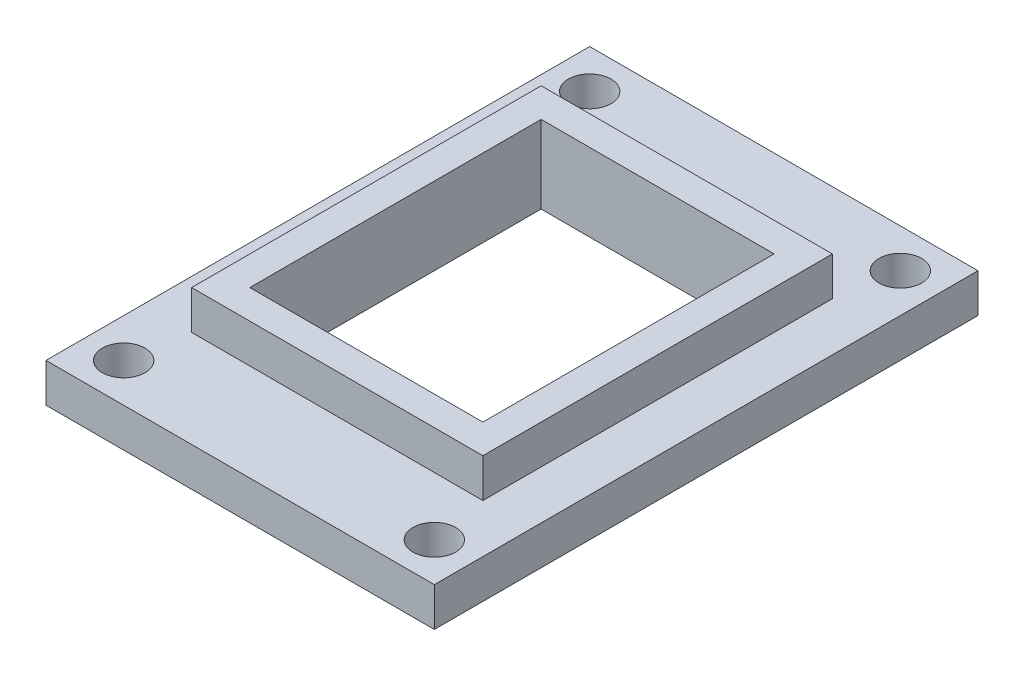
ISO-10303-21;
HEADER;
FILE_DESCRIPTION(('STEP AP214'),'2;1');
FILE_NAME('part.step','',(''),(''),'','','');
FILE_SCHEMA(('AUTOMOTIVE_DESIGN { 1 0 10303 214 1 1 1 1 }'));
ENDSEC;
DATA;
#1=APPLICATION_CONTEXT('core data for automotive mechanical design processes');
#2=APPLICATION_PROTOCOL_DEFINITION('international standard','automotive_design',2000,#1);
#3=PRODUCT_CONTEXT('',#1,'mechanical');
#4=PRODUCT('Part','Part','',(#3));
#5=PRODUCT_RELATED_PRODUCT_CATEGORY('part','',(#4));
#6=PRODUCT_DEFINITION_FORMATION('','',#4);
#7=PRODUCT_DEFINITION_CONTEXT('part definition',#1,'design');
#8=PRODUCT_DEFINITION('design','',#6,#7);
#9=PRODUCT_DEFINITION_SHAPE('','',#8);
#10=(LENGTH_UNIT() NAMED_UNIT(*) SI_UNIT(.MILLI.,.METRE.));
#11=(NAMED_UNIT(*) PLANE_ANGLE_UNIT() SI_UNIT($,.RADIAN.));
#12=(NAMED_UNIT(*) SI_UNIT($,.STERADIAN.) SOLID_ANGLE_UNIT());
#13=UNCERTAINTY_MEASURE_WITH_UNIT(LENGTH_MEASURE(1.E-05),#10,'distance_accuracy_value','');
#14=(GEOMETRIC_REPRESENTATION_CONTEXT(3) GLOBAL_UNCERTAINTY_ASSIGNED_CONTEXT((#13)) GLOBAL_UNIT_ASSIGNED_CONTEXT((#10,
#11,#12)) REPRESENTATION_CONTEXT('',''));
#15=CARTESIAN_POINT('',(0.,0.,0.));
#16=DIRECTION('',(0.,0.,1.));
#17=DIRECTION('',(1.,0.,0.));
#18=AXIS2_PLACEMENT_3D('',#15,#16,#17);
#19=CARTESIAN_POINT('',(0.,5.08,0.));
#20=DIRECTION('',(0.,-1.,0.));
#21=DIRECTION('',(0.,0.,-1.));
#22=AXIS2_PLACEMENT_3D('',#19,#20,#21);
#23=PLANE('',#22);
#24=DIRECTION('',(1.,0.,0.));
#25=VECTOR('',#24,1.);
#26=CARTESIAN_POINT('',(9.525,5.08,11.43));
#27=LINE('',#26,#25);
#28=CARTESIAN_POINT('',(-9.525,5.08,11.43));
#29=VERTEX_POINT('',#28);
#30=CARTESIAN_POINT('',(9.525,5.08,11.43));
#31=VERTEX_POINT('',#30);
#32=EDGE_CURVE('E157',#29,#31,#27,.T.);
#33=ORIENTED_EDGE('',*,*,#32,.T.);
#34=DIRECTION('',(0.,0.,-1.));
#35=VECTOR('',#34,1.);
#36=CARTESIAN_POINT('',(9.525,5.08,11.43));
#37=LINE('',#36,#35);
#38=CARTESIAN_POINT('',(9.525,5.08,-11.43));
#39=VERTEX_POINT('',#38);
#40=EDGE_CURVE('E153',#31,#39,#37,.T.);
#41=ORIENTED_EDGE('',*,*,#40,.T.);
#42=DIRECTION('',(-1.,0.,0.));
#43=VECTOR('',#42,1.);
#44=CARTESIAN_POINT('',(9.525,5.08,-11.43));
#45=LINE('',#44,#43);
#46=CARTESIAN_POINT('',(-9.525,5.08,-11.43));
#47=VERTEX_POINT('',#46);
#48=EDGE_CURVE('E158',#39,#47,#45,.T.);
#49=ORIENTED_EDGE('',*,*,#48,.T.);
#50=DIRECTION('',(0.,0.,1.));
#51=VECTOR('',#50,1.);
#52=CARTESIAN_POINT('',(-9.525,5.08,11.43));
#53=LINE('',#52,#51);
#54=EDGE_CURVE('E162',#47,#29,#53,.T.);
#55=ORIENTED_EDGE('',*,*,#54,.T.);
#56=EDGE_LOOP('',(#33,#41,#49,#55));
#57=FACE_BOUND('',#56,.T.);
#58=DIRECTION('',(0.,0.,1.));
#59=VECTOR('',#58,1.);
#60=CARTESIAN_POINT('',(-7.62,5.08,9.525));
#61=LINE('',#60,#59);
#62=CARTESIAN_POINT('',(-7.62,5.08,-9.525));
#63=VERTEX_POINT('',#62);
#64=CARTESIAN_POINT('',(-7.62,5.08,9.525));
#65=VERTEX_POINT('',#64);
#66=EDGE_CURVE('E245',#63,#65,#61,.T.);
#67=ORIENTED_EDGE('',*,*,#66,.F.);
#68=DIRECTION('',(-1.,0.,0.));
#69=VECTOR('',#68,1.);
#70=CARTESIAN_POINT('',(7.62,5.08,-9.525));
#71=LINE('',#70,#69);
#72=CARTESIAN_POINT('',(7.62,5.08,-9.525));
#73=VERTEX_POINT('',#72);
#74=EDGE_CURVE('E252',#73,#63,#71,.T.);
#75=ORIENTED_EDGE('',*,*,#74,.F.);
#76=DIRECTION('',(0.,0.,-1.));
#77=VECTOR('',#76,1.);
#78=CARTESIAN_POINT('',(7.62,5.08,9.525));
#79=LINE('',#78,#77);
#80=CARTESIAN_POINT('',(7.62,5.08,9.525));
#81=VERTEX_POINT('',#80);
#82=EDGE_CURVE('E250',#81,#73,#79,.T.);
#83=ORIENTED_EDGE('',*,*,#82,.F.);
#84=DIRECTION('',(1.,0.,0.));
#85=VECTOR('',#84,1.);
#86=CARTESIAN_POINT('',(7.62,5.08,9.525));
#87=LINE('',#86,#85);
#88=EDGE_CURVE('E243',#65,#81,#87,.T.);
#89=ORIENTED_EDGE('',*,*,#88,.F.);
#90=EDGE_LOOP('',(#67,#75,#83,#89));
#91=FACE_BOUND('',#90,.T.);
#92=ADVANCED_FACE('F44',(#57,#91),#23,.F.);
#93=CARTESIAN_POINT('',(0.,0.,0.));
#94=DIRECTION('',(0.,-1.,0.));
#95=DIRECTION('',(0.,0.,-1.));
#96=AXIS2_PLACEMENT_3D('',#93,#94,#95);
#97=PLANE('',#96);
#98=DIRECTION('',(-1.,0.,0.));
#99=VECTOR('',#98,1.);
#100=CARTESIAN_POINT('',(7.62,0.,-9.525));
#101=LINE('',#100,#99);
#102=CARTESIAN_POINT('',(7.62,0.,-9.525));
#103=VERTEX_POINT('',#102);
#104=CARTESIAN_POINT('',(-7.62,0.,-9.525));
#105=VERTEX_POINT('',#104);
#106=EDGE_CURVE('E248',#103,#105,#101,.T.);
#107=ORIENTED_EDGE('',*,*,#106,.T.);
#108=DIRECTION('',(0.,0.,1.));
#109=VECTOR('',#108,1.);
#110=CARTESIAN_POINT('',(-7.62,0.,9.525));
#111=LINE('',#110,#109);
#112=CARTESIAN_POINT('',(-7.62,0.,9.525));
#113=VERTEX_POINT('',#112);
#114=EDGE_CURVE('E242',#105,#113,#111,.T.);
#115=ORIENTED_EDGE('',*,*,#114,.T.);
#116=DIRECTION('',(1.,0.,0.));
#117=VECTOR('',#116,1.);
#118=CARTESIAN_POINT('',(7.62,0.,9.525));
#119=LINE('',#118,#117);
#120=CARTESIAN_POINT('',(7.62,0.,9.525));
#121=VERTEX_POINT('',#120);
#122=EDGE_CURVE('E259',#113,#121,#119,.T.);
#123=ORIENTED_EDGE('',*,*,#122,.T.);
#124=DIRECTION('',(0.,0.,-1.));
#125=VECTOR('',#124,1.);
#126=CARTESIAN_POINT('',(7.62,0.,9.525));
#127=LINE('',#126,#125);
#128=EDGE_CURVE('E263',#121,#103,#127,.T.);
#129=ORIENTED_EDGE('',*,*,#128,.T.);
#130=EDGE_LOOP('',(#107,#115,#123,#129));
#131=FACE_BOUND('',#130,.T.);
#132=DIRECTION('',(0.,0.,1.));
#133=VECTOR('',#132,1.);
#134=CARTESIAN_POINT('',(-12.7,0.,-17.78));
#135=LINE('',#134,#133);
#136=CARTESIAN_POINT('',(-12.7,0.,-17.78));
#137=VERTEX_POINT('',#136);
#138=CARTESIAN_POINT('',(-12.7,0.,17.78));
#139=VERTEX_POINT('',#138);
#140=EDGE_CURVE('E200',#137,#139,#135,.T.);
#141=ORIENTED_EDGE('',*,*,#140,.F.);
#142=DIRECTION('',(-1.,0.,0.));
#143=VECTOR('',#142,1.);
#144=CARTESIAN_POINT('',(-12.7,0.,-17.78));
#145=LINE('',#144,#143);
#146=CARTESIAN_POINT('',(12.7,0.,-17.78));
#147=VERTEX_POINT('',#146);
#148=EDGE_CURVE('E202',#147,#137,#145,.T.);
#149=ORIENTED_EDGE('',*,*,#148,.F.);
#150=DIRECTION('',(0.,0.,-1.));
#151=VECTOR('',#150,1.);
#152=CARTESIAN_POINT('',(12.7,0.,-17.78));
#153=LINE('',#152,#151);
#154=CARTESIAN_POINT('',(12.7,0.,17.78));
#155=VERTEX_POINT('',#154);
#156=EDGE_CURVE('E222',#155,#147,#153,.T.);
#157=ORIENTED_EDGE('',*,*,#156,.F.);
#158=DIRECTION('',(1.,0.,0.));
#159=VECTOR('',#158,1.);
#160=CARTESIAN_POINT('',(-12.7,0.,17.78));
#161=LINE('',#160,#159);
#162=EDGE_CURVE('E217',#139,#155,#161,.T.);
#163=ORIENTED_EDGE('',*,*,#162,.F.);
#164=EDGE_LOOP('',(#141,#149,#157,#163));
#165=FACE_BOUND('',#164,.T.);
#166=CARTESIAN_POINT('',(-10.16,0.,-15.24));
#167=DIRECTION('',(0.,1.,0.));
#168=DIRECTION('',(0.,0.,1.));
#169=AXIS2_PLACEMENT_3D('',#166,#167,#168);
#170=CIRCLE('',#169,1.397);
#171=CARTESIAN_POINT('',(-10.16,0.,-13.843));
#172=VERTEX_POINT('',#171);
#173=EDGE_CURVE('E192',#172,#172,#170,.T.);
#174=ORIENTED_EDGE('',*,*,#173,.T.);
#175=EDGE_LOOP('',(#174));
#176=FACE_BOUND('',#175,.T.);
#177=CARTESIAN_POINT('',(10.16,0.,-15.24));
#178=DIRECTION('',(0.,1.,0.));
#179=DIRECTION('',(0.,0.,-1.));
#180=AXIS2_PLACEMENT_3D('',#177,#178,#179);
#181=CIRCLE('',#180,1.397);
#182=CARTESIAN_POINT('',(10.16,0.,-16.637));
#183=VERTEX_POINT('',#182);
#184=EDGE_CURVE('E481',#183,#183,#181,.T.);
#185=ORIENTED_EDGE('',*,*,#184,.T.);
#186=EDGE_LOOP('',(#185));
#187=FACE_BOUND('',#186,.T.);
#188=CARTESIAN_POINT('',(-10.16,0.,15.24));
#189=DIRECTION('',(0.,1.,0.));
#190=DIRECTION('',(0.,0.,-1.));
#191=AXIS2_PLACEMENT_3D('',#188,#189,#190);
#192=CIRCLE('',#191,1.397);
#193=CARTESIAN_POINT('',(-10.16,0.,13.843));
#194=VERTEX_POINT('',#193);
#195=EDGE_CURVE('E475',#194,#194,#192,.T.);
#196=ORIENTED_EDGE('',*,*,#195,.T.);
#197=EDGE_LOOP('',(#196));
#198=FACE_BOUND('',#197,.T.);
#199=CARTESIAN_POINT('',(10.16,0.,15.24));
#200=DIRECTION('',(0.,1.,0.));
#201=DIRECTION('',(0.,0.,1.));
#202=AXIS2_PLACEMENT_3D('',#199,#200,#201);
#203=CIRCLE('',#202,1.397);
#204=CARTESIAN_POINT('',(10.16,0.,16.637));
#205=VERTEX_POINT('',#204);
#206=EDGE_CURVE('E470',#205,#205,#203,.T.);
#207=ORIENTED_EDGE('',*,*,#206,.T.);
#208=EDGE_LOOP('',(#207));
#209=FACE_BOUND('',#208,.T.);
#210=ADVANCED_FACE('F283',(#131,#165,#176,#187,#198,#209),#97,.T.);
#211=CARTESIAN_POINT('',(9.525,5.08,11.43));
#212=DIRECTION('',(0.,0.,-1.));
#213=DIRECTION('',(-1.,0.,0.));
#214=AXIS2_PLACEMENT_3D('',#211,#212,#213);
#215=PLANE('',#214);
#216=DIRECTION('',(0.,-1.,0.));
#217=VECTOR('',#216,1.);
#218=CARTESIAN_POINT('',(-9.525,5.08,11.43));
#219=LINE('',#218,#217);
#220=CARTESIAN_POINT('',(-9.525,2.54,11.43));
#221=VERTEX_POINT('',#220);
#222=EDGE_CURVE('E146',#29,#221,#219,.T.);
#223=ORIENTED_EDGE('',*,*,#222,.T.);
#224=DIRECTION('',(1.,0.,0.));
#225=VECTOR('',#224,1.);
#226=CARTESIAN_POINT('',(-9.525,2.54,11.43));
#227=LINE('',#226,#225);
#228=CARTESIAN_POINT('',(9.525,2.54,11.43));
#229=VERTEX_POINT('',#228);
#230=EDGE_CURVE('E62',#221,#229,#227,.T.);
#231=ORIENTED_EDGE('',*,*,#230,.T.);
#232=DIRECTION('',(0.,-1.,0.));
#233=VECTOR('',#232,1.);
#234=CARTESIAN_POINT('',(9.525,5.08,11.43));
#235=LINE('',#234,#233);
#236=EDGE_CURVE('E11',#31,#229,#235,.T.);
#237=ORIENTED_EDGE('',*,*,#236,.F.);
#238=ORIENTED_EDGE('',*,*,#32,.F.);
#239=EDGE_LOOP('',(#223,#231,#237,#238));
#240=FACE_BOUND('',#239,.T.);
#241=ADVANCED_FACE('F50',(#240),#215,.F.);
#242=CARTESIAN_POINT('',(9.525,5.08,11.43));
#243=DIRECTION('',(-1.,0.,0.));
#244=DIRECTION('',(0.,0.,1.));
#245=AXIS2_PLACEMENT_3D('',#242,#243,#244);
#246=PLANE('',#245);
#247=ORIENTED_EDGE('',*,*,#236,.T.);
#248=DIRECTION('',(0.,0.,-1.));
#249=VECTOR('',#248,1.);
#250=CARTESIAN_POINT('',(9.525,2.54,11.43));
#251=LINE('',#250,#249);
#252=CARTESIAN_POINT('',(9.525,2.54,-11.43));
#253=VERTEX_POINT('',#252);
#254=EDGE_CURVE('E134',#229,#253,#251,.T.);
#255=ORIENTED_EDGE('',*,*,#254,.T.);
#256=DIRECTION('',(0.,-1.,0.));
#257=VECTOR('',#256,1.);
#258=CARTESIAN_POINT('',(9.525,5.08,-11.43));
#259=LINE('',#258,#257);
#260=EDGE_CURVE('E53',#39,#253,#259,.T.);
#261=ORIENTED_EDGE('',*,*,#260,.F.);
#262=ORIENTED_EDGE('',*,*,#40,.F.);
#263=EDGE_LOOP('',(#247,#255,#261,#262));
#264=FACE_BOUND('',#263,.T.);
#265=ADVANCED_FACE('F155',(#264),#246,.F.);
#266=CARTESIAN_POINT('',(9.525,5.08,-11.43));
#267=DIRECTION('',(0.,0.,1.));
#268=DIRECTION('',(1.,0.,0.));
#269=AXIS2_PLACEMENT_3D('',#266,#267,#268);
#270=PLANE('',#269);
#271=ORIENTED_EDGE('',*,*,#260,.T.);
#272=DIRECTION('',(-1.,0.,0.));
#273=VECTOR('',#272,1.);
#274=CARTESIAN_POINT('',(9.525,2.54,-11.43));
#275=LINE('',#274,#273);
#276=CARTESIAN_POINT('',(-9.525,2.54,-11.43));
#277=VERTEX_POINT('',#276);
#278=EDGE_CURVE('E139',#253,#277,#275,.T.);
#279=ORIENTED_EDGE('',*,*,#278,.T.);
#280=DIRECTION('',(0.,-1.,0.));
#281=VECTOR('',#280,1.);
#282=CARTESIAN_POINT('',(-9.525,5.08,-11.43));
#283=LINE('',#282,#281);
#284=EDGE_CURVE('E180',#47,#277,#283,.T.);
#285=ORIENTED_EDGE('',*,*,#284,.F.);
#286=ORIENTED_EDGE('',*,*,#48,.F.);
#287=EDGE_LOOP('',(#271,#279,#285,#286));
#288=FACE_BOUND('',#287,.T.);
#289=ADVANCED_FACE('F184',(#288),#270,.F.);
#290=CARTESIAN_POINT('',(-9.525,5.08,11.43));
#291=DIRECTION('',(1.,0.,0.));
#292=DIRECTION('',(0.,0.,-1.));
#293=AXIS2_PLACEMENT_3D('',#290,#291,#292);
#294=PLANE('',#293);
#295=ORIENTED_EDGE('',*,*,#284,.T.);
#296=DIRECTION('',(0.,0.,1.));
#297=VECTOR('',#296,1.);
#298=CARTESIAN_POINT('',(-9.525,2.54,-11.43));
#299=LINE('',#298,#297);
#300=EDGE_CURVE('E147',#277,#221,#299,.T.);
#301=ORIENTED_EDGE('',*,*,#300,.T.);
#302=ORIENTED_EDGE('',*,*,#222,.F.);
#303=ORIENTED_EDGE('',*,*,#54,.F.);
#304=EDGE_LOOP('',(#295,#301,#302,#303));
#305=FACE_BOUND('',#304,.T.);
#306=ADVANCED_FACE('F190',(#305),#294,.F.);
#307=CARTESIAN_POINT('',(-7.62,5.08,9.525));
#308=DIRECTION('',(1.,0.,0.));
#309=DIRECTION('',(0.,0.,-1.));
#310=AXIS2_PLACEMENT_3D('',#307,#308,#309);
#311=PLANE('',#310);
#312=ORIENTED_EDGE('',*,*,#114,.F.);
#313=DIRECTION('',(0.,-1.,0.));
#314=VECTOR('',#313,1.);
#315=CARTESIAN_POINT('',(-7.62,5.08,-9.525));
#316=LINE('',#315,#314);
#317=EDGE_CURVE('E254',#63,#105,#316,.T.);
#318=ORIENTED_EDGE('',*,*,#317,.F.);
#319=ORIENTED_EDGE('',*,*,#66,.T.);
#320=DIRECTION('',(0.,-1.,0.));
#321=VECTOR('',#320,1.);
#322=CARTESIAN_POINT('',(-7.62,5.08,9.525));
#323=LINE('',#322,#321);
#324=EDGE_CURVE('E164',#65,#113,#323,.T.);
#325=ORIENTED_EDGE('',*,*,#324,.T.);
#326=EDGE_LOOP('',(#312,#318,#319,#325));
#327=FACE_BOUND('',#326,.T.);
#328=ADVANCED_FACE('F290',(#327),#311,.T.);
#329=CARTESIAN_POINT('',(7.62,5.08,9.525));
#330=DIRECTION('',(0.,0.,-1.));
#331=DIRECTION('',(-1.,0.,0.));
#332=AXIS2_PLACEMENT_3D('',#329,#330,#331);
#333=PLANE('',#332);
#334=ORIENTED_EDGE('',*,*,#122,.F.);
#335=ORIENTED_EDGE('',*,*,#324,.F.);
#336=ORIENTED_EDGE('',*,*,#88,.T.);
#337=DIRECTION('',(0.,-1.,0.));
#338=VECTOR('',#337,1.);
#339=CARTESIAN_POINT('',(7.62,5.08,9.525));
#340=LINE('',#339,#338);
#341=EDGE_CURVE('E166',#81,#121,#340,.T.);
#342=ORIENTED_EDGE('',*,*,#341,.T.);
#343=EDGE_LOOP('',(#334,#335,#336,#342));
#344=FACE_BOUND('',#343,.T.);
#345=ADVANCED_FACE('F279',(#344),#333,.T.);
#346=CARTESIAN_POINT('',(7.62,5.08,9.525));
#347=DIRECTION('',(-1.,0.,0.));
#348=DIRECTION('',(0.,0.,1.));
#349=AXIS2_PLACEMENT_3D('',#346,#347,#348);
#350=PLANE('',#349);
#351=ORIENTED_EDGE('',*,*,#128,.F.);
#352=ORIENTED_EDGE('',*,*,#341,.F.);
#353=ORIENTED_EDGE('',*,*,#82,.T.);
#354=DIRECTION('',(0.,-1.,0.));
#355=VECTOR('',#354,1.);
#356=CARTESIAN_POINT('',(7.62,5.08,-9.525));
#357=LINE('',#356,#355);
#358=EDGE_CURVE('E70',#73,#103,#357,.T.);
#359=ORIENTED_EDGE('',*,*,#358,.T.);
#360=EDGE_LOOP('',(#351,#352,#353,#359));
#361=FACE_BOUND('',#360,.T.);
#362=ADVANCED_FACE('F284',(#361),#350,.T.);
#363=CARTESIAN_POINT('',(7.62,5.08,-9.525));
#364=DIRECTION('',(0.,0.,1.));
#365=DIRECTION('',(1.,0.,0.));
#366=AXIS2_PLACEMENT_3D('',#363,#364,#365);
#367=PLANE('',#366);
#368=ORIENTED_EDGE('',*,*,#106,.F.);
#369=ORIENTED_EDGE('',*,*,#358,.F.);
#370=ORIENTED_EDGE('',*,*,#74,.T.);
#371=ORIENTED_EDGE('',*,*,#317,.T.);
#372=EDGE_LOOP('',(#368,#369,#370,#371));
#373=FACE_BOUND('',#372,.T.);
#374=ADVANCED_FACE('F292',(#373),#367,.T.);
#375=CARTESIAN_POINT('',(0.,2.54,0.));
#376=DIRECTION('',(0.,1.,0.));
#377=DIRECTION('',(0.,0.,1.));
#378=AXIS2_PLACEMENT_3D('',#375,#376,#377);
#379=PLANE('',#378);
#380=CARTESIAN_POINT('',(-10.16,2.54,15.24));
#381=DIRECTION('',(0.,1.,0.));
#382=DIRECTION('',(0.,0.,-1.));
#383=AXIS2_PLACEMENT_3D('',#380,#381,#382);
#384=CIRCLE('',#383,1.397);
#385=CARTESIAN_POINT('',(-10.16,2.54,13.843));
#386=VERTEX_POINT('',#385);
#387=EDGE_CURVE('E480',#386,#386,#384,.T.);
#388=ORIENTED_EDGE('',*,*,#387,.F.);
#389=EDGE_LOOP('',(#388));
#390=FACE_BOUND('',#389,.T.);
#391=CARTESIAN_POINT('',(-10.16,2.54,-15.24));
#392=DIRECTION('',(0.,1.,0.));
#393=DIRECTION('',(0.,0.,1.));
#394=AXIS2_PLACEMENT_3D('',#391,#392,#393);
#395=CIRCLE('',#394,1.397);
#396=CARTESIAN_POINT('',(-10.16,2.54,-13.843));
#397=VERTEX_POINT('',#396);
#398=EDGE_CURVE('E186',#397,#397,#395,.T.);
#399=ORIENTED_EDGE('',*,*,#398,.F.);
#400=EDGE_LOOP('',(#399));
#401=FACE_BOUND('',#400,.T.);
#402=DIRECTION('',(0.,0.,1.));
#403=VECTOR('',#402,1.);
#404=CARTESIAN_POINT('',(-12.7,2.54,-17.78));
#405=LINE('',#404,#403);
#406=CARTESIAN_POINT('',(-12.7,2.54,-17.78));
#407=VERTEX_POINT('',#406);
#408=CARTESIAN_POINT('',(-12.7,2.54,17.78));
#409=VERTEX_POINT('',#408);
#410=EDGE_CURVE('E199',#407,#409,#405,.T.);
#411=ORIENTED_EDGE('',*,*,#410,.T.);
#412=DIRECTION('',(1.,0.,0.));
#413=VECTOR('',#412,1.);
#414=CARTESIAN_POINT('',(-12.7,2.54,17.78));
#415=LINE('',#414,#413);
#416=CARTESIAN_POINT('',(12.7,2.54,17.78));
#417=VERTEX_POINT('',#416);
#418=EDGE_CURVE('E204',#409,#417,#415,.T.);
#419=ORIENTED_EDGE('',*,*,#418,.T.);
#420=DIRECTION('',(0.,0.,-1.));
#421=VECTOR('',#420,1.);
#422=CARTESIAN_POINT('',(12.7,2.54,-17.78));
#423=LINE('',#422,#421);
#424=CARTESIAN_POINT('',(12.7,2.54,-17.78));
#425=VERTEX_POINT('',#424);
#426=EDGE_CURVE('E208',#417,#425,#423,.T.);
#427=ORIENTED_EDGE('',*,*,#426,.T.);
#428=DIRECTION('',(-1.,0.,0.));
#429=VECTOR('',#428,1.);
#430=CARTESIAN_POINT('',(-12.7,2.54,-17.78));
#431=LINE('',#430,#429);
#432=EDGE_CURVE('E211',#425,#407,#431,.T.);
#433=ORIENTED_EDGE('',*,*,#432,.T.);
#434=EDGE_LOOP('',(#411,#419,#427,#433));
#435=FACE_BOUND('',#434,.T.);
#436=ORIENTED_EDGE('',*,*,#230,.F.);
#437=ORIENTED_EDGE('',*,*,#300,.F.);
#438=ORIENTED_EDGE('',*,*,#278,.F.);
#439=ORIENTED_EDGE('',*,*,#254,.F.);
#440=EDGE_LOOP('',(#436,#437,#438,#439));
#441=FACE_BOUND('',#440,.T.);
#442=CARTESIAN_POINT('',(10.16,2.54,-15.24));
#443=DIRECTION('',(0.,1.,0.));
#444=DIRECTION('',(0.,0.,-1.));
#445=AXIS2_PLACEMENT_3D('',#442,#443,#444);
#446=CIRCLE('',#445,1.397);
#447=CARTESIAN_POINT('',(10.16,2.54,-16.637));
#448=VERTEX_POINT('',#447);
#449=EDGE_CURVE('E484',#448,#448,#446,.T.);
#450=ORIENTED_EDGE('',*,*,#449,.F.);
#451=EDGE_LOOP('',(#450));
#452=FACE_BOUND('',#451,.T.);
#453=CARTESIAN_POINT('',(10.16,2.54,15.24));
#454=DIRECTION('',(0.,1.,0.));
#455=DIRECTION('',(0.,0.,1.));
#456=AXIS2_PLACEMENT_3D('',#453,#454,#455);
#457=CIRCLE('',#456,1.397);
#458=CARTESIAN_POINT('',(10.16,2.54,16.637));
#459=VERTEX_POINT('',#458);
#460=EDGE_CURVE('E468',#459,#459,#457,.T.);
#461=ORIENTED_EDGE('',*,*,#460,.F.);
#462=EDGE_LOOP('',(#461));
#463=FACE_BOUND('',#462,.T.);
#464=ADVANCED_FACE('F131',(#390,#401,#435,#441,#452,#463),#379,.T.);
#465=CARTESIAN_POINT('',(-12.7,2.54,-17.78));
#466=DIRECTION('',(1.,0.,0.));
#467=DIRECTION('',(0.,0.,-1.));
#468=AXIS2_PLACEMENT_3D('',#465,#466,#467);
#469=PLANE('',#468);
#470=ORIENTED_EDGE('',*,*,#140,.T.);
#471=DIRECTION('',(0.,-1.,0.));
#472=VECTOR('',#471,1.);
#473=CARTESIAN_POINT('',(-12.7,2.54,17.78));
#474=LINE('',#473,#472);
#475=EDGE_CURVE('E240',#409,#139,#474,.T.);
#476=ORIENTED_EDGE('',*,*,#475,.F.);
#477=ORIENTED_EDGE('',*,*,#410,.F.);
#478=DIRECTION('',(0.,-1.,0.));
#479=VECTOR('',#478,1.);
#480=CARTESIAN_POINT('',(-12.7,2.54,-17.78));
#481=LINE('',#480,#479);
#482=EDGE_CURVE('E212',#407,#137,#481,.T.);
#483=ORIENTED_EDGE('',*,*,#482,.T.);
#484=EDGE_LOOP('',(#470,#476,#477,#483));
#485=FACE_BOUND('',#484,.T.);
#486=ADVANCED_FACE('F374',(#485),#469,.F.);
#487=CARTESIAN_POINT('',(-12.7,2.54,17.78));
#488=DIRECTION('',(0.,0.,-1.));
#489=DIRECTION('',(-1.,0.,0.));
#490=AXIS2_PLACEMENT_3D('',#487,#488,#489);
#491=PLANE('',#490);
#492=ORIENTED_EDGE('',*,*,#162,.T.);
#493=DIRECTION('',(0.,-1.,0.));
#494=VECTOR('',#493,1.);
#495=CARTESIAN_POINT('',(12.7,2.54,17.78));
#496=LINE('',#495,#494);
#497=EDGE_CURVE('E232',#417,#155,#496,.T.);
#498=ORIENTED_EDGE('',*,*,#497,.F.);
#499=ORIENTED_EDGE('',*,*,#418,.F.);
#500=ORIENTED_EDGE('',*,*,#475,.T.);
#501=EDGE_LOOP('',(#492,#498,#499,#500));
#502=FACE_BOUND('',#501,.T.);
#503=ADVANCED_FACE('F383',(#502),#491,.F.);
#504=CARTESIAN_POINT('',(12.7,2.54,-17.78));
#505=DIRECTION('',(-1.,0.,0.));
#506=DIRECTION('',(0.,0.,1.));
#507=AXIS2_PLACEMENT_3D('',#504,#505,#506);
#508=PLANE('',#507);
#509=ORIENTED_EDGE('',*,*,#156,.T.);
#510=DIRECTION('',(0.,-1.,0.));
#511=VECTOR('',#510,1.);
#512=CARTESIAN_POINT('',(12.7,2.54,-17.78));
#513=LINE('',#512,#511);
#514=EDGE_CURVE('E226',#425,#147,#513,.T.);
#515=ORIENTED_EDGE('',*,*,#514,.F.);
#516=ORIENTED_EDGE('',*,*,#426,.F.);
#517=ORIENTED_EDGE('',*,*,#497,.T.);
#518=EDGE_LOOP('',(#509,#515,#516,#517));
#519=FACE_BOUND('',#518,.T.);
#520=ADVANCED_FACE('F394',(#519),#508,.F.);
#521=CARTESIAN_POINT('',(-12.7,2.54,-17.78));
#522=DIRECTION('',(0.,0.,1.));
#523=DIRECTION('',(1.,0.,0.));
#524=AXIS2_PLACEMENT_3D('',#521,#522,#523);
#525=PLANE('',#524);
#526=ORIENTED_EDGE('',*,*,#148,.T.);
#527=ORIENTED_EDGE('',*,*,#482,.F.);
#528=ORIENTED_EDGE('',*,*,#432,.F.);
#529=ORIENTED_EDGE('',*,*,#514,.T.);
#530=EDGE_LOOP('',(#526,#527,#528,#529));
#531=FACE_BOUND('',#530,.T.);
#532=ADVANCED_FACE('F405',(#531),#525,.F.);
#533=CARTESIAN_POINT('',(-10.16,2.54,-15.24));
#534=DIRECTION('',(0.,-1.,0.));
#535=DIRECTION('',(0.,0.,-1.));
#536=AXIS2_PLACEMENT_3D('',#533,#534,#535);
#537=CYLINDRICAL_SURFACE('',#536,1.397);
#538=ORIENTED_EDGE('',*,*,#398,.T.);
#539=EDGE_LOOP('',(#538));
#540=FACE_BOUND('',#539,.T.);
#541=ORIENTED_EDGE('',*,*,#173,.F.);
#542=EDGE_LOOP('',(#541));
#543=FACE_BOUND('',#542,.T.);
#544=ADVANCED_FACE('F413',(#540,#543),#537,.F.);
#545=CARTESIAN_POINT('',(10.16,2.54,-15.24));
#546=DIRECTION('',(0.,-1.,0.));
#547=DIRECTION('',(0.,0.,-1.));
#548=AXIS2_PLACEMENT_3D('',#545,#546,#547);
#549=CYLINDRICAL_SURFACE('',#548,1.397);
#550=ORIENTED_EDGE('',*,*,#449,.T.);
#551=EDGE_LOOP('',(#550));
#552=FACE_BOUND('',#551,.T.);
#553=ORIENTED_EDGE('',*,*,#184,.F.);
#554=EDGE_LOOP('',(#553));
#555=FACE_BOUND('',#554,.T.);
#556=ADVANCED_FACE('F419',(#552,#555),#549,.F.);
#557=CARTESIAN_POINT('',(-10.16,2.54,15.24));
#558=DIRECTION('',(0.,-1.,0.));
#559=DIRECTION('',(0.,0.,-1.));
#560=AXIS2_PLACEMENT_3D('',#557,#558,#559);
#561=CYLINDRICAL_SURFACE('',#560,1.397);
#562=ORIENTED_EDGE('',*,*,#387,.T.);
#563=EDGE_LOOP('',(#562));
#564=FACE_BOUND('',#563,.T.);
#565=ORIENTED_EDGE('',*,*,#195,.F.);
#566=EDGE_LOOP('',(#565));
#567=FACE_BOUND('',#566,.T.);
#568=ADVANCED_FACE('F427',(#564,#567),#561,.F.);
#569=CARTESIAN_POINT('',(10.16,2.54,15.24));
#570=DIRECTION('',(0.,-1.,0.));
#571=DIRECTION('',(0.,0.,-1.));
#572=AXIS2_PLACEMENT_3D('',#569,#570,#571);
#573=CYLINDRICAL_SURFACE('',#572,1.397);
#574=ORIENTED_EDGE('',*,*,#460,.T.);
#575=EDGE_LOOP('',(#574));
#576=FACE_BOUND('',#575,.T.);
#577=ORIENTED_EDGE('',*,*,#206,.F.);
#578=EDGE_LOOP('',(#577));
#579=FACE_BOUND('',#578,.T.);
#580=ADVANCED_FACE('F437',(#576,#579),#573,.F.);
#581=CLOSED_SHELL('',(#92,#210,#241,#265,#289,#306,#328,#345,#362,#374,#464,#486,#503,#520,#532,
#544,#556,#568,#580));
#582=MANIFOLD_SOLID_BREP('B2',#581);
#583=ADVANCED_BREP_SHAPE_REPRESENTATION('',(#18,#582),#14);
#584=SHAPE_DEFINITION_REPRESENTATION(#9,#583);
ENDSEC;
END-ISO-10303-21;
